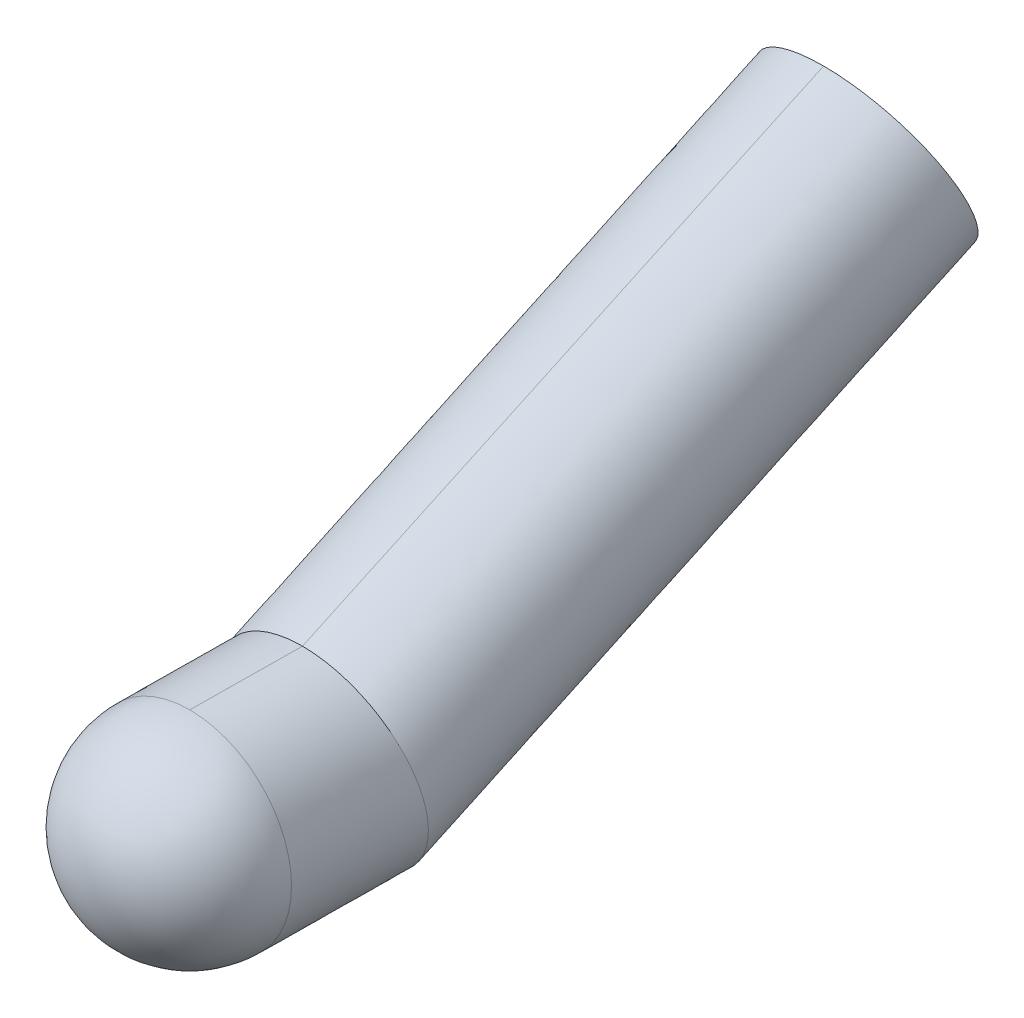
ISO-10303-21;
HEADER;
FILE_DESCRIPTION(('STEP AP214'),'2;1');
FILE_NAME('part.step','',(''),(''),'','','');
FILE_SCHEMA(('AUTOMOTIVE_DESIGN { 1 0 10303 214 1 1 1 1 }'));
ENDSEC;
DATA;
#1=APPLICATION_CONTEXT('core data for automotive mechanical design processes');
#2=APPLICATION_PROTOCOL_DEFINITION('international standard','automotive_design',2000,#1);
#3=PRODUCT_CONTEXT('',#1,'mechanical');
#4=PRODUCT('Part','Part','',(#3));
#5=PRODUCT_RELATED_PRODUCT_CATEGORY('part','',(#4));
#6=PRODUCT_DEFINITION_FORMATION('','',#4);
#7=PRODUCT_DEFINITION_CONTEXT('part definition',#1,'design');
#8=PRODUCT_DEFINITION('design','',#6,#7);
#9=PRODUCT_DEFINITION_SHAPE('','',#8);
#10=(LENGTH_UNIT() NAMED_UNIT(*) SI_UNIT(.MILLI.,.METRE.));
#11=(NAMED_UNIT(*) PLANE_ANGLE_UNIT() SI_UNIT($,.RADIAN.));
#12=(NAMED_UNIT(*) SI_UNIT($,.STERADIAN.) SOLID_ANGLE_UNIT());
#13=UNCERTAINTY_MEASURE_WITH_UNIT(LENGTH_MEASURE(1.E-05),#10,'distance_accuracy_value','');
#14=(GEOMETRIC_REPRESENTATION_CONTEXT(3) GLOBAL_UNCERTAINTY_ASSIGNED_CONTEXT((#13)) GLOBAL_UNIT_ASSIGNED_CONTEXT((#10,
#11,#12)) REPRESENTATION_CONTEXT('',''));
#15=CARTESIAN_POINT('',(0.,0.,0.));
#16=DIRECTION('',(0.,0.,1.));
#17=DIRECTION('',(1.,0.,0.));
#18=AXIS2_PLACEMENT_3D('',#15,#16,#17);
#19=CARTESIAN_POINT('',(0.,12.3214383809007,-33.3168285453092));
#20=DIRECTION('',(0.,-0.430690797341834,0.902499549631497));
#21=DIRECTION('',(1.,0.,0.));
#22=AXIS2_PLACEMENT_3D('',#19,#20,#21);
#23=PLANE('',#22);
#24=CARTESIAN_POINT('',(0.,12.3214383809007,-33.3168285453092));
#25=DIRECTION('',(0.,-0.430690797341834,0.902499549631497));
#26=DIRECTION('',(1.,0.,0.));
#27=AXIS2_PLACEMENT_3D('',#24,#25,#26);
#28=CIRCLE('',#27,5.);
#29=CARTESIAN_POINT('',(0.,7.80894063274323,-35.4702825320184));
#30=VERTEX_POINT('',#29);
#31=CARTESIAN_POINT('',(0.,16.8339361290582,-31.1633745586));
#32=VERTEX_POINT('',#31);
#33=EDGE_CURVE('E171',#30,#32,#28,.T.);
#34=ORIENTED_EDGE('',*,*,#33,.F.);
#35=CARTESIAN_POINT('',(0.,12.3214383809007,-33.3168285453092));
#36=DIRECTION('',(0.,-0.430690797341834,0.902499549631497));
#37=DIRECTION('',(1.,0.,0.));
#38=AXIS2_PLACEMENT_3D('',#35,#36,#37);
#39=CIRCLE('',#38,5.);
#40=EDGE_CURVE('E176',#32,#30,#39,.T.);
#41=ORIENTED_EDGE('',*,*,#40,.F.);
#42=EDGE_LOOP('',(#34,#41));
#43=FACE_BOUND('',#42,.T.);
#44=ADVANCED_FACE('F43',(#43),#23,.F.);
#45=CARTESIAN_POINT('',(0.,3.85064143605935,-3.19118658133679));
#46=CARTESIAN_POINT('',(0.,16.8339361290582,-31.1633745586));
#47=CARTESIAN_POINT('',(-10.0000000000001,3.85064143605935,-3.19118658133679));
#48=CARTESIAN_POINT('',(-10.0000000000001,16.8339361290582,-31.1633745586));
#49=CARTESIAN_POINT('',(-10.,-5.17435406025568,-7.49809455475517));
#50=CARTESIAN_POINT('',(-10.,7.80894063274317,-35.4702825320184));
#51=CARTESIAN_POINT('',(0.,-5.17435406025562,-7.49809455475514));
#52=CARTESIAN_POINT('',(0.,7.80894063274323,-35.4702825320183));
#53=(BOUNDED_SURFACE() B_SPLINE_SURFACE(3,1,((#45,#46),(#47,#48),(#49,#50),(#51,#52)),
.UNSPECIFIED.,.F.,.F.,.F.) B_SPLINE_SURFACE_WITH_KNOTS((4,4),(2,2),(0.,1.),(0.,1.),
.UNSPECIFIED.) GEOMETRIC_REPRESENTATION_ITEM() RATIONAL_B_SPLINE_SURFACE(((1.,1.),
(0.333333333333331,0.333333333333331),(0.333333333333331,0.333333333333331),(1.,1.))) REPRESENTATION_ITEM('') SURFACE());
#54=CARTESIAN_POINT('',(0.,-5.08234907797199,-7.69631701832367));
#55=CARTESIAN_POINT('',(-0.138119996722711,-5.08236595626814,-7.69632064986761));
#56=CARTESIAN_POINT('',(-0.276236529249563,-5.07661345668632,-7.69508293873943));
#57=CARTESIAN_POINT('',(-0.55145516855939,-5.05369297928917,-7.69015135560169));
#58=CARTESIAN_POINT('',(-0.688557420799474,-5.03652667171456,-7.68645784296208));
#59=CARTESIAN_POINT('',(-0.960591128805558,-4.9909336110534,-7.67664801373127));
#60=CARTESIAN_POINT('',(-1.09552534589526,-4.96252259885359,-7.67053508395834));
#61=CARTESIAN_POINT('',(-1.36246870174074,-4.89467480737508,-7.65593691400791));
#62=CARTESIAN_POINT('',(-1.49447766994282,-4.85523738702868,-7.64745153589792));
#63=CARTESIAN_POINT('',(-1.75467400852488,-4.76564044666204,-7.62817380652739));
#64=CARTESIAN_POINT('',(-1.88286026882529,-4.71547784603835,-7.61738079244245));
#65=CARTESIAN_POINT('',(-2.13445786159541,-4.60485006476279,-7.59357805521096));
#66=CARTESIAN_POINT('',(-2.25787016858631,-4.54438700053889,-7.58056878743629));
#67=CARTESIAN_POINT('',(-2.4990753067451,-4.4136385570875,-7.55243687692507));
#68=CARTESIAN_POINT('',(-2.61687013313326,-4.34335670068685,-7.53731499216198));
#69=CARTESIAN_POINT('',(-2.8461785212204,-4.19345788311856,-7.50506267610947));
#70=CARTESIAN_POINT('',(-2.95768650956988,-4.11383282592487,-7.48793050287441));
#71=CARTESIAN_POINT('',(-3.28372028096397,-3.86017527893677,-7.4333533987499));
#72=CARTESIAN_POINT('',(-3.48746520786279,-3.67260502354972,-7.39299567440669));
#73=CARTESIAN_POINT('',(-3.86071213076907,-3.26731535182217,-7.30579331485891));
#74=CARTESIAN_POINT('',(-4.03020756671178,-3.04959017311492,-7.25894743982019));
#75=CARTESIAN_POINT('',(-4.25742353199768,-2.70252933069607,-7.18427362877398));
#76=CARTESIAN_POINT('',(-4.3293438844411,-2.58186789470222,-7.1583120446057));
#77=CARTESIAN_POINT('',(-4.46268008622901,-2.33523408301478,-7.1052461714199));
#78=CARTESIAN_POINT('',(-4.52410597992506,-2.20926693109326,-7.07814300635219));
#79=CARTESIAN_POINT('',(-4.6361652102137,-1.95277544468809,-7.02295615018804));
#80=CARTESIAN_POINT('',(-4.68679417706956,-1.82224928986062,-6.99487206742536));
#81=CARTESIAN_POINT('',(-4.77695059805472,-1.55754621360032,-6.93791840085137));
#82=CARTESIAN_POINT('',(-4.8164752821012,-1.42336839035986,-6.9090486230066));
#83=CARTESIAN_POINT('',(-4.88492148934307,-1.1493227361789,-6.85008480197822));
#84=CARTESIAN_POINT('',(-4.91359079236891,-1.00939466405718,-6.81997779726731));
#85=CARTESIAN_POINT('',(-4.95891507058383,-0.727638938199476,-6.75935507276964));
#86=CARTESIAN_POINT('',(-4.97556556949699,-0.585810596738613,-6.7288392050116));
#87=CARTESIAN_POINT('',(-4.99673414775501,-0.30132892785933,-6.66762996504104));
#88=CARTESIAN_POINT('',(-5.0012554306398,-0.158675828251346,-6.63693664184433));
#89=CARTESIAN_POINT('',(-4.99814775498013,0.126556352040334,-6.57556592140537));
#90=CARTESIAN_POINT('',(-4.99051429131003,0.26913538567598,-6.54488853428599));
#91=CARTESIAN_POINT('',(-4.96297689989871,0.554799957931074,-6.48342478014277));
#92=CARTESIAN_POINT('',(-4.94293394874679,0.697872711134772,-6.45264116403634));
#93=CARTESIAN_POINT('',(-4.89056696785044,0.981909284188894,-6.39152769114026));
#94=CARTESIAN_POINT('',(-4.85823836016672,1.12287229752229,-6.36119800788127));
#95=CARTESIAN_POINT('',(-4.78151132863145,1.40157187048616,-6.30123284700309));
#96=CARTESIAN_POINT('',(-4.73711708887991,1.53930953064807,-6.27159713259292));
#97=CARTESIAN_POINT('',(-4.63651112164872,1.810651642169,-6.21321500736273));
#98=CARTESIAN_POINT('',(-4.58029533794732,1.94425465674659,-6.18446890568142));
#99=CARTESIAN_POINT('',(-4.45667119834518,2.20573496504358,-6.12820865172137));
#100=CARTESIAN_POINT('',(-4.38931095492892,2.33363399423307,-6.10068982282634));
#101=CARTESIAN_POINT('',(-4.24366490758121,2.58334083670474,-6.04696275456442));
#102=CARTESIAN_POINT('',(-4.16537931121898,2.70514876565116,-6.02075449031116));
#103=CARTESIAN_POINT('',(-3.99838711709135,2.94175266011623,-5.96984665990037));
#104=CARTESIAN_POINT('',(-3.909679608877,3.0565480116889,-5.94514722583983));
#105=CARTESIAN_POINT('',(-3.72248074619091,3.27817231623363,-5.89746241263683));
#106=CARTESIAN_POINT('',(-3.62399317699136,3.38500432352571,-5.8744763763251));
#107=CARTESIAN_POINT('',(-3.41976434548363,3.58802510035861,-5.83079430887545));
#108=CARTESIAN_POINT('',(-3.31418776775037,3.68437221742064,-5.81006420759351));
#109=CARTESIAN_POINT('',(-3.09499870729279,3.86780510325031,-5.77059668207078));
#110=CARTESIAN_POINT('',(-2.98138951554065,3.95489462867207,-5.75185844954612));
#111=CARTESIAN_POINT('',(-2.74682285260203,4.11919934482032,-5.71650655204555));
#112=CARTESIAN_POINT('',(-2.62586090136181,4.19640842458579,-5.69989420190753));
#113=CARTESIAN_POINT('',(-2.3775728563199,4.34021780601019,-5.66895209244823));
#114=CARTESIAN_POINT('',(-2.25024938430817,4.40682243149368,-5.65462140281036));
#115=CARTESIAN_POINT('',(-1.99319646873642,4.52745710237363,-5.62866557743943));
#116=CARTESIAN_POINT('',(-1.86359416210087,4.58174618541728,-5.61698470701679));
#117=CARTESIAN_POINT('',(-1.60015559088178,4.67923844238481,-5.59600821677225));
#118=CARTESIAN_POINT('',(-1.46632109885798,4.72244619018088,-5.58671161283339));
#119=CARTESIAN_POINT('',(-1.19551801016525,4.79739553902614,-5.57058546770361));
#120=CARTESIAN_POINT('',(-1.05855353768443,4.82915139686672,-5.56375285901324));
#121=CARTESIAN_POINT('',(-0.782390665283811,4.88099146274503,-5.55259892053652));
#122=CARTESIAN_POINT('',(-0.643193471937692,4.90108177011903,-5.54827627841345));
#123=CARTESIAN_POINT('',(-0.419723404378806,4.92374906894893,-5.54339916932228));
#124=CARTESIAN_POINT('',(-0.335834637123145,4.93011898885798,-5.54202861368035));
#125=CARTESIAN_POINT('',(-0.167967109310975,4.9386044420855,-5.54020287866935));
#126=CARTESIAN_POINT('',(-0.0839887084109753,4.9407267768818,-5.53974623589037));
#127=CARTESIAN_POINT('',(0.,4.94072580288783,-5.53974644545548));
#128=B_SPLINE_CURVE_WITH_KNOTS('',3,(#54,#55,#56,#57,#58,#59,#60,#61,#62,#63,#64,#65,#66,#67,
#68,#69,#70,#71,#72,#73,#74,#75,#76,#77,#78,#79,#80,#81,#82,#83,#84,#85,#86,#87,#88,#89,#90,#91,
#92,#93,#94,#95,#96,#97,#98,#99,#100,#101,#102,#103,#104,#105,#106,#107,#108,#109,#110,#111,
#112,#113,#114,#115,#116,#117,#118,#119,#120,#121,#122,#123,#124,#125,#126,#127),.UNSPECIFIED.,
.F.,.F.,(4,2,2,2,2,2,2,2,2,2,2,2,2,2,2,2,2,2,2,2,2,2,2,2,2,2,2,2,2,2,2,2,2,2,2,2,4),(0.,
0.414229569192631,0.828398535397589,1.24198976668982,1.65560504889058,2.06933929417593,
2.48298863212194,2.89648993857723,3.31035223362175,4.14584172268389,4.9814910880111,
5.40962405445065,5.83734492660544,6.2652385789774,6.69323887943587,7.13064896794624,
7.56822188125998,8.00567921246425,8.44329872385281,8.88591187912506,9.32869012497348,
9.77131502039569,10.2140920383155,10.6550051402907,11.0959098665616,11.5368531385575,
11.9776264082764,12.41037580147,12.8429489127307,13.2757882863925,13.7084507211037,
14.1309310433089,14.5532367031437,14.9750147924771,15.3965721559852,15.6488941104357,
15.9008117081498),.UNSPECIFIED.);
#129=CARTESIAN_POINT('',(0.,-5.08234907797199,-7.69631701832367));
#130=VERTEX_POINT('',#129);
#131=CARTESIAN_POINT('',(0.,4.94072580288783,-5.53974644545548));
#132=VERTEX_POINT('',#131);
#133=EDGE_CURVE('E160',#130,#132,#128,.T.);
#134=DIRECTION('',(0.,0.421010130563801,-0.907055935410078));
#135=VECTOR('',#134,1.);
#136=CARTESIAN_POINT('',(0.,3.85064143605935,-3.19118658133679));
#137=LINE('',#136,#135);
#138=EDGE_CURVE('E89',#132,#32,#137,.T.);
#139=DIRECTION('',(0.,0.421010130563801,-0.907055935410078));
#140=VECTOR('',#139,1.);
#141=CARTESIAN_POINT('',(0.,-5.17435406025562,-7.49809455475514));
#142=LINE('',#141,#140);
#143=EDGE_CURVE('E179',#130,#30,#142,.T.);
#144=ORIENTED_EDGE('',*,*,#133,.T.);
#145=ORIENTED_EDGE('',*,*,#138,.T.);
#146=ORIENTED_EDGE('',*,*,#40,.T.);
#147=ORIENTED_EDGE('',*,*,#143,.F.);
#148=EDGE_LOOP('',(#144,#145,#146,#147));
#149=FACE_BOUND('',#148,.T.);
#150=ADVANCED_FACE('F102',(#149),#53,.F.);
#151=CARTESIAN_POINT('',(0.,-5.17435406025562,-7.49809455475514));
#152=CARTESIAN_POINT('',(0.,7.80894063274323,-35.4702825320183));
#153=CARTESIAN_POINT('',(9.99999999999996,-5.17435406025556,-7.49809455475511));
#154=CARTESIAN_POINT('',(9.99999999999996,7.8089406327433,-35.4702825320183));
#155=CARTESIAN_POINT('',(9.99999999999993,3.85064143605935,-3.1911865813368));
#156=CARTESIAN_POINT('',(9.99999999999993,16.8339361290582,-31.1633745586));
#157=CARTESIAN_POINT('',(0.,3.85064143605935,-3.19118658133679));
#158=CARTESIAN_POINT('',(0.,16.8339361290582,-31.1633745586));
#159=(BOUNDED_SURFACE() B_SPLINE_SURFACE(3,1,((#151,#152),(#153,#154),(#155,#156),(#157,#158)),
.UNSPECIFIED.,.F.,.F.,.F.) B_SPLINE_SURFACE_WITH_KNOTS((4,4),(2,2),(0.,1.),(0.,1.),
.UNSPECIFIED.) GEOMETRIC_REPRESENTATION_ITEM() RATIONAL_B_SPLINE_SURFACE(((1.,1.),
(0.333333333333336,0.333333333333336),(0.333333333333336,0.333333333333336),(1.,1.))) REPRESENTATION_ITEM('') SURFACE());
#160=CARTESIAN_POINT('',(0.,4.94072580288783,-5.53974644545548));
#161=CARTESIAN_POINT('',(0.138119996722746,4.94074268118398,-5.53974281391154));
#162=CARTESIAN_POINT('',(0.276236529249598,4.93499018160216,-5.54098052503972));
#163=CARTESIAN_POINT('',(0.551455168559426,4.91206970420501,-5.54591210817746));
#164=CARTESIAN_POINT('',(0.688557420799509,4.89490339663039,-5.54960562081707));
#165=CARTESIAN_POINT('',(0.960591128805593,4.84931033596923,-5.55941545004788));
#166=CARTESIAN_POINT('',(1.0955253458953,4.82089932376942,-5.56552837982081));
#167=CARTESIAN_POINT('',(1.36246870174077,4.75305153229092,-5.58012654977124));
#168=CARTESIAN_POINT('',(1.49447766994286,4.71361411194452,-5.58861192788123));
#169=CARTESIAN_POINT('',(1.75467400852491,4.62401717157787,-5.60788965725176));
#170=CARTESIAN_POINT('',(1.88286026882533,4.57385457095418,-5.6186826713367));
#171=CARTESIAN_POINT('',(2.13445786159544,4.46322678967861,-5.64248540856819));
#172=CARTESIAN_POINT('',(2.25787016858634,4.40276372545472,-5.65549467634286));
#173=CARTESIAN_POINT('',(2.49907530674513,4.27201528200332,-5.68362658685408));
#174=CARTESIAN_POINT('',(2.61687013313329,4.20173342560268,-5.69874847161717));
#175=CARTESIAN_POINT('',(2.84617852122043,4.05183460803438,-5.73100078766968));
#176=CARTESIAN_POINT('',(2.9576865095699,3.97220955084069,-5.74813296090474));
#177=CARTESIAN_POINT('',(3.283720280964,3.71855200385259,-5.80271006502925));
#178=CARTESIAN_POINT('',(3.48746520786282,3.53098174846554,-5.84306778937246));
#179=CARTESIAN_POINT('',(3.86071213076909,3.12569207673798,-5.93027014892024));
#180=CARTESIAN_POINT('',(4.0302075667118,2.90796689803073,-5.97711602395897));
#181=CARTESIAN_POINT('',(4.2574235319977,2.56090605561188,-6.05178983500518));
#182=CARTESIAN_POINT('',(4.32934388444111,2.44024461961803,-6.07775141917345));
#183=CARTESIAN_POINT('',(4.46268008622903,2.19361080793059,-6.13081729235925));
#184=CARTESIAN_POINT('',(4.52410597992507,2.06764365600907,-6.15792045742696));
#185=CARTESIAN_POINT('',(4.63616521021372,1.8111521696039,-6.21310731359112));
#186=CARTESIAN_POINT('',(4.68679417706958,1.68062601477643,-6.24119139635379));
#187=CARTESIAN_POINT('',(4.77695059805473,1.41592293851613,-6.29814506292779));
#188=CARTESIAN_POINT('',(4.81647528210121,1.28174511527567,-6.32701484077256));
#189=CARTESIAN_POINT('',(4.88492148934308,1.00769946109471,-6.38597866180093));
#190=CARTESIAN_POINT('',(4.91359079236891,0.867771388972982,-6.41608566651185));
#191=CARTESIAN_POINT('',(4.95891507058383,0.586015663115282,-6.47670839100951));
#192=CARTESIAN_POINT('',(4.97556556949699,0.444187321654419,-6.50722425876755));
#193=CARTESIAN_POINT('',(4.99673414775501,0.159705652775135,-6.56843349873811));
#194=CARTESIAN_POINT('',(5.0012554306398,0.0170525531671511,-6.59912682193482));
#195=CARTESIAN_POINT('',(4.99814775498012,-0.26817962712453,-6.66049754237379));
#196=CARTESIAN_POINT('',(4.99051429131002,-0.410758660760176,-6.69117492949316));
#197=CARTESIAN_POINT('',(4.9629768998987,-0.69642323301527,-6.75263868363638));
#198=CARTESIAN_POINT('',(4.94293394874678,-0.839495986218968,-6.78342229974281));
#199=CARTESIAN_POINT('',(4.89056696785043,-1.12353255927309,-6.8445357726389));
#200=CARTESIAN_POINT('',(4.8582383601667,-1.26449557260648,-6.87486545589789));
#201=CARTESIAN_POINT('',(4.78151132863144,-1.54319514557035,-6.93483061677607));
#202=CARTESIAN_POINT('',(4.73711708887989,-1.68093280573227,-6.96446633118624));
#203=CARTESIAN_POINT('',(4.6365111216487,-1.95227491725319,-7.02284845641643));
#204=CARTESIAN_POINT('',(4.5802953379473,-2.08587793183078,-7.05159455809773));
#205=CARTESIAN_POINT('',(4.45667119834516,-2.34735824012777,-7.10785481205778));
#206=CARTESIAN_POINT('',(4.3893109549289,-2.47525726931726,-7.13537364095281));
#207=CARTESIAN_POINT('',(4.24366490758119,-2.72496411178894,-7.18910070921473));
#208=CARTESIAN_POINT('',(4.16537931121896,-2.84677204073535,-7.215308973468));
#209=CARTESIAN_POINT('',(3.99838711709132,-3.08337593520042,-7.26621680387878));
#210=CARTESIAN_POINT('',(3.90967960887697,-3.19817128677309,-7.29091623793932));
#211=CARTESIAN_POINT('',(3.72248074619088,-3.41979559131781,-7.33860105114233));
#212=CARTESIAN_POINT('',(3.62399317699133,-3.52662759860989,-7.36158708745405));
#213=CARTESIAN_POINT('',(3.4197643454836,-3.7296483754428,-7.40526915490371));
#214=CARTESIAN_POINT('',(3.31418776775034,-3.82599549250482,-7.42599925618564));
#215=CARTESIAN_POINT('',(3.09499870729276,-4.00942837833449,-7.46546678170837));
#216=CARTESIAN_POINT('',(2.98138951554062,-4.09651790375625,-7.48420501423303));
#217=CARTESIAN_POINT('',(2.74682285260199,-4.2608226199045,-7.5195569117336));
#218=CARTESIAN_POINT('',(2.62586090136177,-4.33803169966997,-7.53616926187162));
#219=CARTESIAN_POINT('',(2.37757285631987,-4.48184108109437,-7.56711137133092));
#220=CARTESIAN_POINT('',(2.25024938430813,-4.54844570657785,-7.58144206096878));
#221=CARTESIAN_POINT('',(1.99319646873639,-4.6690803774578,-7.60739788633971));
#222=CARTESIAN_POINT('',(1.86359416210083,-4.72336946050145,-7.61907875676236));
#223=CARTESIAN_POINT('',(1.60015559088174,-4.82086171746898,-7.6400552470069));
#224=CARTESIAN_POINT('',(1.46632109885794,-4.86406946526505,-7.64935185094576));
#225=CARTESIAN_POINT('',(1.19551801016521,-4.93901881411031,-7.66547799607554));
#226=CARTESIAN_POINT('',(1.05855353768439,-4.97077467195088,-7.67231060476591));
#227=CARTESIAN_POINT('',(0.782390665283771,-5.02261473782919,-7.68346454324263));
#228=CARTESIAN_POINT('',(0.643193471937652,-5.04270504520319,-7.68778718536569));
#229=CARTESIAN_POINT('',(0.419723404378778,-5.06537234403309,-7.69266429445687));
#230=CARTESIAN_POINT('',(0.33583463712313,-5.07174226394213,-7.69403485009879));
#231=CARTESIAN_POINT('',(0.167967109310985,-5.08022771716966,-7.6958605851098));
#232=CARTESIAN_POINT('',(0.0839887084109979,-5.08235005196595,-7.69631722788878));
#233=CARTESIAN_POINT('',(0.,-5.08234907797199,-7.69631701832367));
#234=B_SPLINE_CURVE_WITH_KNOTS('',3,(#160,#161,#162,#163,#164,#165,#166,#167,#168,#169,#170,
#171,#172,#173,#174,#175,#176,#177,#178,#179,#180,#181,#182,#183,#184,#185,#186,#187,#188,#189,
#190,#191,#192,#193,#194,#195,#196,#197,#198,#199,#200,#201,#202,#203,#204,#205,#206,#207,#208,
#209,#210,#211,#212,#213,#214,#215,#216,#217,#218,#219,#220,#221,#222,#223,#224,#225,#226,#227,
#228,#229,#230,#231,#232,#233),.UNSPECIFIED.,.F.,.F.,(4,2,2,2,2,2,2,2,2,2,2,2,2,2,2,2,2,2,2,2,2,
2,2,2,2,2,2,2,2,2,2,2,2,2,2,2,4),(0.,0.414229569192632,0.82839853539759,1.24198976668982,
1.65560504889058,2.06933929417593,2.48298863212194,2.89648993857724,3.31035223362175,
4.14584172268389,4.9814910880111,5.40962405445065,5.83734492660545,6.2652385789774,
6.69323887943587,7.13064896794625,7.56822188125999,8.00567921246426,8.44329872385281,
8.88591187912507,9.32869012497349,9.77131502039569,10.2140920383155,10.6550051402907,
11.0959098665616,11.5368531385575,11.9776264082764,12.41037580147,12.8429489127307,
13.2757882863926,13.7084507211037,14.1309310433089,14.5532367031437,14.9750147924771,
15.3965721559852,15.6488941104357,15.9008117081497),.UNSPECIFIED.);
#235=EDGE_CURVE('E54',#132,#130,#234,.T.);
#236=ORIENTED_EDGE('',*,*,#235,.T.);
#237=ORIENTED_EDGE('',*,*,#143,.T.);
#238=ORIENTED_EDGE('',*,*,#33,.T.);
#239=ORIENTED_EDGE('',*,*,#138,.F.);
#240=EDGE_LOOP('',(#236,#237,#238,#239));
#241=FACE_BOUND('',#240,.T.);
#242=ADVANCED_FACE('F107',(#241),#159,.F.);
#243=CARTESIAN_POINT('',(0.,-5.,0.));
#244=CARTESIAN_POINT('',(0.,-5.08457274109811,-7.90413982316906));
#245=CARTESIAN_POINT('',(9.99999999999996,-4.99999999999993,0.));
#246=CARTESIAN_POINT('',(9.99999999999996,-5.08457274109804,-7.90413982316906));
#247=CARTESIAN_POINT('',(9.99999999999993,5.,0.));
#248=CARTESIAN_POINT('',(9.99999999999993,4.91542725890189,-7.90413982316906));
#249=CARTESIAN_POINT('',(0.,5.,0.));
#250=CARTESIAN_POINT('',(0.,4.91542725890189,-7.90413982316906));
#251=(BOUNDED_SURFACE() B_SPLINE_SURFACE(3,1,((#243,#244),(#245,#246),(#247,#248),(#249,#250)),
.UNSPECIFIED.,.F.,.F.,.F.) B_SPLINE_SURFACE_WITH_KNOTS((4,4),(2,2),(0.,1.),(0.,1.),
.UNSPECIFIED.) GEOMETRIC_REPRESENTATION_ITEM() RATIONAL_B_SPLINE_SURFACE(((1.,1.),
(0.333333333333336,0.333333333333336),(0.333333333333336,0.333333333333336),(1.,1.))) REPRESENTATION_ITEM('') SURFACE());
#252=DIRECTION('',(0.,-0.0106991908312815,-0.999942762019685));
#253=VECTOR('',#252,1.);
#254=CARTESIAN_POINT('',(0.,5.,0.));
#255=LINE('',#254,#253);
#256=CARTESIAN_POINT('',(0.,5.,0.));
#257=VERTEX_POINT('',#256);
#258=CARTESIAN_POINT('',(0.,4.99885527315556,-0.106985784311917));
#259=VERTEX_POINT('',#258);
#260=EDGE_CURVE('E47',#257,#259,#255,.T.);
#261=CARTESIAN_POINT('',(0.,0.,0.));
#262=DIRECTION('',(0.,0.,1.));
#263=DIRECTION('',(1.,0.,0.));
#264=AXIS2_PLACEMENT_3D('',#261,#262,#263);
#265=CIRCLE('',#264,5.);
#266=CARTESIAN_POINT('',(0.,-5.,0.));
#267=VERTEX_POINT('',#266);
#268=EDGE_CURVE('E11',#267,#257,#265,.T.);
#269=DIRECTION('',(0.,-0.0106991908312815,-0.999942762019685));
#270=VECTOR('',#269,1.);
#271=CARTESIAN_POINT('',(0.,-5.,0.));
#272=LINE('',#271,#270);
#273=EDGE_CURVE('E62',#267,#130,#272,.T.);
#274=EDGE_CURVE('E70',#259,#132,#255,.T.);
#275=ORIENTED_EDGE('',*,*,#260,.F.);
#276=ORIENTED_EDGE('',*,*,#268,.F.);
#277=ORIENTED_EDGE('',*,*,#273,.T.);
#278=ORIENTED_EDGE('',*,*,#235,.F.);
#279=ORIENTED_EDGE('',*,*,#274,.F.);
#280=EDGE_LOOP('',(#275,#276,#277,#278,#279));
#281=FACE_BOUND('',#280,.T.);
#282=ADVANCED_FACE('F92',(#281),#251,.F.);
#283=CARTESIAN_POINT('',(0.,5.,0.));
#284=CARTESIAN_POINT('',(0.,4.91542725890189,-7.90413982316906));
#285=CARTESIAN_POINT('',(-10.0000000000001,5.,0.));
#286=CARTESIAN_POINT('',(-10.0000000000001,4.91542725890189,-7.90413982316906));
#287=CARTESIAN_POINT('',(-10.,-5.00000000000007,0.));
#288=CARTESIAN_POINT('',(-10.,-5.08457274109818,-7.90413982316906));
#289=CARTESIAN_POINT('',(0.,-5.,0.));
#290=CARTESIAN_POINT('',(0.,-5.08457274109811,-7.90413982316906));
#291=(BOUNDED_SURFACE() B_SPLINE_SURFACE(3,1,((#283,#284),(#285,#286),(#287,#288),(#289,#290)),
.UNSPECIFIED.,.F.,.F.,.F.) B_SPLINE_SURFACE_WITH_KNOTS((4,4),(2,2),(0.,1.),(0.,1.),
.UNSPECIFIED.) GEOMETRIC_REPRESENTATION_ITEM() RATIONAL_B_SPLINE_SURFACE(((1.,1.),
(0.333333333333331,0.333333333333331),(0.333333333333331,0.333333333333331),(1.,1.))) REPRESENTATION_ITEM('') SURFACE());
#292=CARTESIAN_POINT('',(0.,0.,0.));
#293=DIRECTION('',(0.,0.,1.));
#294=DIRECTION('',(1.,0.,0.));
#295=AXIS2_PLACEMENT_3D('',#292,#293,#294);
#296=CIRCLE('',#295,5.);
#297=EDGE_CURVE('E84',#257,#267,#296,.T.);
#298=ORIENTED_EDGE('',*,*,#273,.F.);
#299=ORIENTED_EDGE('',*,*,#297,.F.);
#300=ORIENTED_EDGE('',*,*,#260,.T.);
#301=ORIENTED_EDGE('',*,*,#274,.T.);
#302=ORIENTED_EDGE('',*,*,#133,.F.);
#303=EDGE_LOOP('',(#298,#299,#300,#301,#302));
#304=FACE_BOUND('',#303,.T.);
#305=ADVANCED_FACE('F85',(#304),#291,.F.);
#306=CARTESIAN_POINT('',(0.,0.,0.));
#307=DIRECTION('',(0.,1.,0.));
#308=DIRECTION('',(1.,0.,0.));
#309=AXIS2_PLACEMENT_3D('',#306,#307,#308);
#310=SPHERICAL_SURFACE('',#309,5.);
#311=ORIENTED_EDGE('',*,*,#268,.T.);
#312=ORIENTED_EDGE('',*,*,#297,.T.);
#313=EDGE_LOOP('',(#311,#312));
#314=FACE_BOUND('',#313,.T.);
#315=ADVANCED_FACE('F45',(#314),#310,.T.);
#316=CLOSED_SHELL('',(#44,#150,#242,#282,#305,#315));
#317=MANIFOLD_SOLID_BREP('B2',#316);
#318=ADVANCED_BREP_SHAPE_REPRESENTATION('',(#18,#317),#14);
#319=SHAPE_DEFINITION_REPRESENTATION(#9,#318);
ENDSEC;
END-ISO-10303-21;
